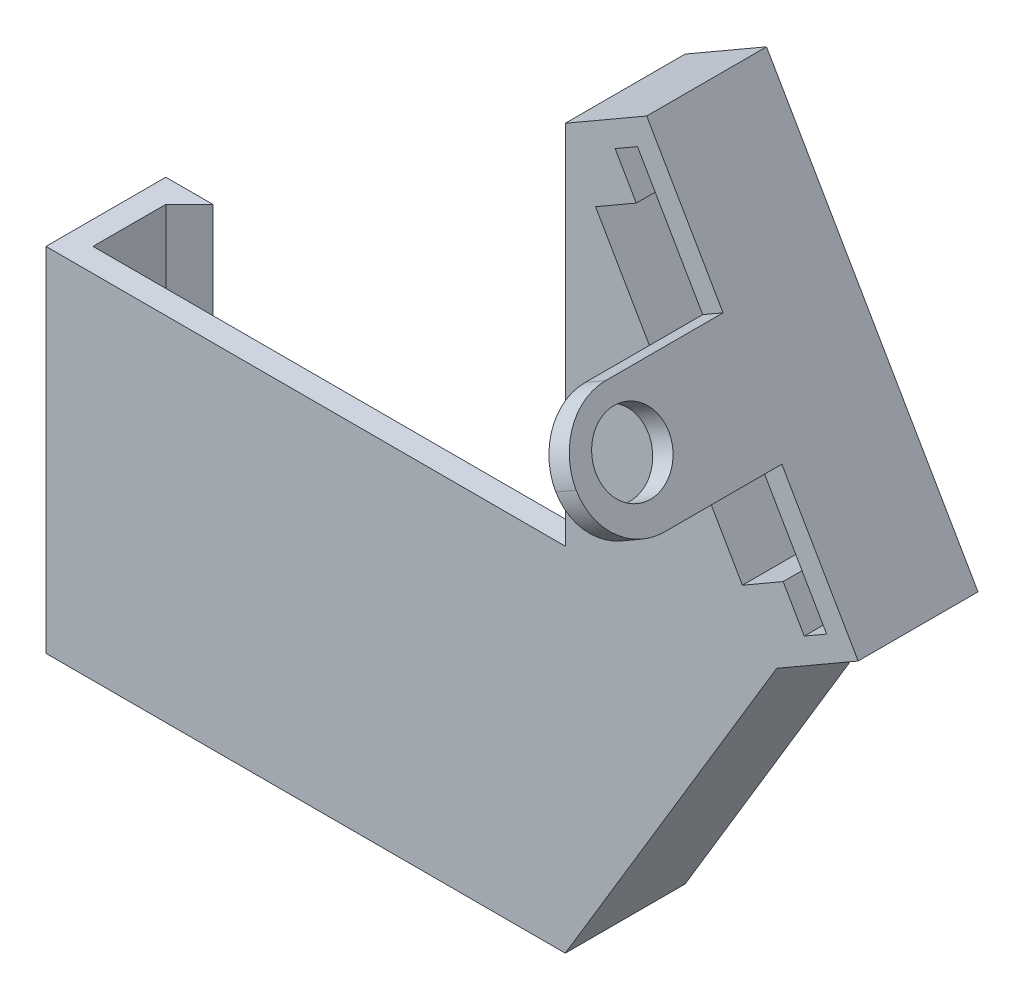
ISO-10303-21;
HEADER;
FILE_DESCRIPTION(('STEP AP214'),'2;1');
FILE_NAME('part.step','',(''),(''),'','','');
FILE_SCHEMA(('AUTOMOTIVE_DESIGN { 1 0 10303 214 1 1 1 1 }'));
ENDSEC;
DATA;
#1=APPLICATION_CONTEXT('core data for automotive mechanical design processes');
#2=APPLICATION_PROTOCOL_DEFINITION('international standard','automotive_design',2000,#1);
#3=PRODUCT_CONTEXT('',#1,'mechanical');
#4=PRODUCT('Part','Part','',(#3));
#5=PRODUCT_RELATED_PRODUCT_CATEGORY('part','',(#4));
#6=PRODUCT_DEFINITION_FORMATION('','',#4);
#7=PRODUCT_DEFINITION_CONTEXT('part definition',#1,'design');
#8=PRODUCT_DEFINITION('design','',#6,#7);
#9=PRODUCT_DEFINITION_SHAPE('','',#8);
#10=(LENGTH_UNIT() NAMED_UNIT(*) SI_UNIT(.MILLI.,.METRE.));
#11=(NAMED_UNIT(*) PLANE_ANGLE_UNIT() SI_UNIT($,.RADIAN.));
#12=(NAMED_UNIT(*) SI_UNIT($,.STERADIAN.) SOLID_ANGLE_UNIT());
#13=UNCERTAINTY_MEASURE_WITH_UNIT(LENGTH_MEASURE(1.E-05),#10,'distance_accuracy_value','');
#14=(GEOMETRIC_REPRESENTATION_CONTEXT(3) GLOBAL_UNCERTAINTY_ASSIGNED_CONTEXT((#13)) GLOBAL_UNIT_ASSIGNED_CONTEXT((#10,
#11,#12)) REPRESENTATION_CONTEXT('',''));
#15=CARTESIAN_POINT('',(0.,0.,0.));
#16=DIRECTION('',(0.,0.,1.));
#17=DIRECTION('',(1.,0.,0.));
#18=AXIS2_PLACEMENT_3D('',#15,#16,#17);
#19=CARTESIAN_POINT('',(-18.1,30.,-5.09999999999998));
#20=DIRECTION('',(-0.707106781186544,0.,-0.707106781186552));
#21=DIRECTION('',(-0.707106781186552,0.,0.707106781186544));
#22=AXIS2_PLACEMENT_3D('',#19,#20,#21);
#23=PLANE('',#22);
#24=DIRECTION('',(0.707106781186552,0.,-0.707106781186544));
#25=VECTOR('',#24,1.);
#26=CARTESIAN_POINT('',(-18.1,0.,-5.09999999999998));
#27=LINE('',#26,#25);
#28=CARTESIAN_POINT('',(-20.1,0.,-3.1));
#29=VERTEX_POINT('',#28);
#30=CARTESIAN_POINT('',(-18.1,0.,-5.09999999999998));
#31=VERTEX_POINT('',#30);
#32=EDGE_CURVE('E337',#29,#31,#27,.T.);
#33=ORIENTED_EDGE('',*,*,#32,.T.);
#34=DIRECTION('',(0.,-1.,0.));
#35=VECTOR('',#34,1.);
#36=CARTESIAN_POINT('',(-18.1,30.,-5.09999999999998));
#37=LINE('',#36,#35);
#38=CARTESIAN_POINT('',(-18.1,30.,-5.09999999999998));
#39=VERTEX_POINT('',#38);
#40=EDGE_CURVE('E411',#39,#31,#37,.T.);
#41=ORIENTED_EDGE('',*,*,#40,.F.);
#42=DIRECTION('',(0.707106781186552,0.,-0.707106781186544));
#43=VECTOR('',#42,1.);
#44=CARTESIAN_POINT('',(-18.1,30.,-5.09999999999998));
#45=LINE('',#44,#43);
#46=CARTESIAN_POINT('',(-20.1,30.,-3.1));
#47=VERTEX_POINT('',#46);
#48=EDGE_CURVE('E338',#47,#39,#45,.T.);
#49=ORIENTED_EDGE('',*,*,#48,.F.);
#50=DIRECTION('',(0.,-1.,0.));
#51=VECTOR('',#50,1.);
#52=CARTESIAN_POINT('',(-20.1,30.,-3.1));
#53=LINE('',#52,#51);
#54=EDGE_CURVE('E364',#47,#29,#53,.T.);
#55=ORIENTED_EDGE('',*,*,#54,.T.);
#56=EDGE_LOOP('',(#33,#41,#49,#55));
#57=FACE_BOUND('',#56,.T.);
#58=ADVANCED_FACE('F33',(#57),#23,.F.);
#59=CARTESIAN_POINT('',(-22.1,30.,-5.09999999999998));
#60=DIRECTION('',(0.,0.,1.));
#61=DIRECTION('',(1.,0.,0.));
#62=AXIS2_PLACEMENT_3D('',#59,#60,#61);
#63=PLANE('',#62);
#64=DIRECTION('',(-1.,0.,0.));
#65=VECTOR('',#64,1.);
#66=CARTESIAN_POINT('',(-22.1,0.,-5.09999999999998));
#67=LINE('',#66,#65);
#68=CARTESIAN_POINT('',(-22.1,0.,-5.09999999999998));
#69=VERTEX_POINT('',#68);
#70=EDGE_CURVE('E367',#31,#69,#67,.T.);
#71=ORIENTED_EDGE('',*,*,#70,.T.);
#72=DIRECTION('',(0.,-1.,0.));
#73=VECTOR('',#72,1.);
#74=CARTESIAN_POINT('',(-22.1,30.,-5.09999999999998));
#75=LINE('',#74,#73);
#76=CARTESIAN_POINT('',(-22.1,30.,-5.09999999999998));
#77=VERTEX_POINT('',#76);
#78=EDGE_CURVE('E408',#77,#69,#75,.T.);
#79=ORIENTED_EDGE('',*,*,#78,.F.);
#80=DIRECTION('',(-1.,0.,0.));
#81=VECTOR('',#80,1.);
#82=CARTESIAN_POINT('',(-22.1,30.,-5.09999999999998));
#83=LINE('',#82,#81);
#84=EDGE_CURVE('E341',#39,#77,#83,.T.);
#85=ORIENTED_EDGE('',*,*,#84,.F.);
#86=ORIENTED_EDGE('',*,*,#40,.T.);
#87=EDGE_LOOP('',(#71,#79,#85,#86));
#88=FACE_BOUND('',#87,.T.);
#89=ADVANCED_FACE('F462',(#88),#63,.F.);
#90=CARTESIAN_POINT('',(-22.1,30.,5.1));
#91=DIRECTION('',(1.,0.,0.));
#92=DIRECTION('',(0.,0.,-1.));
#93=AXIS2_PLACEMENT_3D('',#90,#91,#92);
#94=PLANE('',#93);
#95=DIRECTION('',(0.,0.,1.));
#96=VECTOR('',#95,1.);
#97=CARTESIAN_POINT('',(-22.1,0.,5.1));
#98=LINE('',#97,#96);
#99=CARTESIAN_POINT('',(-22.1,0.,5.1));
#100=VERTEX_POINT('',#99);
#101=EDGE_CURVE('E369',#69,#100,#98,.T.);
#102=ORIENTED_EDGE('',*,*,#101,.T.);
#103=DIRECTION('',(0.,-1.,0.));
#104=VECTOR('',#103,1.);
#105=CARTESIAN_POINT('',(-22.1,30.,5.1));
#106=LINE('',#105,#104);
#107=CARTESIAN_POINT('',(-22.1,30.,5.1));
#108=VERTEX_POINT('',#107);
#109=EDGE_CURVE('E405',#108,#100,#106,.T.);
#110=ORIENTED_EDGE('',*,*,#109,.F.);
#111=DIRECTION('',(0.,0.,1.));
#112=VECTOR('',#111,1.);
#113=CARTESIAN_POINT('',(-22.1,30.,5.1));
#114=LINE('',#113,#112);
#115=EDGE_CURVE('E344',#77,#108,#114,.T.);
#116=ORIENTED_EDGE('',*,*,#115,.F.);
#117=ORIENTED_EDGE('',*,*,#78,.T.);
#118=EDGE_LOOP('',(#102,#110,#116,#117));
#119=FACE_BOUND('',#118,.T.);
#120=ADVANCED_FACE('F468',(#119),#94,.F.);
#121=CARTESIAN_POINT('',(22.1,30.,5.1));
#122=DIRECTION('',(0.,0.,-1.));
#123=DIRECTION('',(-1.,0.,0.));
#124=AXIS2_PLACEMENT_3D('',#121,#122,#123);
#125=PLANE('',#124);
#126=DIRECTION('',(-0.499999999999994,0.866025403784442,0.));
#127=VECTOR('',#126,1.);
#128=CARTESIAN_POINT('',(44.3461524227063,34.6454482671902,5.1));
#129=LINE('',#128,#127);
#130=CARTESIAN_POINT('',(33.7961524227064,52.918584287042,5.1));
#131=VERTEX_POINT('',#130);
#132=CARTESIAN_POINT('',(28.2461524227065,62.5314662690493,5.1));
#133=VERTEX_POINT('',#132);
#134=EDGE_CURVE('E271',#131,#133,#129,.T.);
#135=ORIENTED_EDGE('',*,*,#134,.F.);
#136=DIRECTION('',(0.866025403784442,0.499999999999994,0.));
#137=VECTOR('',#136,1.);
#138=CARTESIAN_POINT('',(18.1836574267103,43.9047060983821,5.1));
#139=LINE('',#138,#137);
#140=CARTESIAN_POINT('',(35.5282032302755,53.9185842870421,5.1));
#141=VERTEX_POINT('',#140);
#142=EDGE_CURVE('E228',#131,#141,#139,.T.);
#143=ORIENTED_EDGE('',*,*,#142,.T.);
#144=DIRECTION('',(-0.499999999999994,0.866025403784442,0.));
#145=VECTOR('',#144,1.);
#146=CARTESIAN_POINT('',(47.0282032302753,34.,5.1));
#147=LINE('',#146,#145);
#148=CARTESIAN_POINT('',(29.0282032302756,65.1769145362399,5.1));
#149=VERTEX_POINT('',#148);
#150=EDGE_CURVE('E241',#141,#149,#147,.T.);
#151=ORIENTED_EDGE('',*,*,#150,.T.);
#152=DIRECTION('',(-0.866025403784441,-0.499999999999996,0.));
#153=VECTOR('',#152,1.);
#154=CARTESIAN_POINT('',(29.0282032302756,65.1769145362399,5.1));
#155=LINE('',#154,#153);
#156=CARTESIAN_POINT('',(22.1,61.1769145362399,5.1));
#157=VERTEX_POINT('',#156);
#158=EDGE_CURVE('E240',#149,#157,#155,.T.);
#159=ORIENTED_EDGE('',*,*,#158,.T.);
#160=DIRECTION('',(0.,-1.,0.));
#161=VECTOR('',#160,1.);
#162=CARTESIAN_POINT('',(22.1,0.,5.1));
#163=LINE('',#162,#161);
#164=CARTESIAN_POINT('',(22.1,30.,5.1));
#165=VERTEX_POINT('',#164);
#166=EDGE_CURVE('E323',#157,#165,#163,.T.);
#167=ORIENTED_EDGE('',*,*,#166,.T.);
#168=DIRECTION('',(1.,0.,0.));
#169=VECTOR('',#168,1.);
#170=CARTESIAN_POINT('',(22.1,30.,5.1));
#171=LINE('',#170,#169);
#172=EDGE_CURVE('E346',#108,#165,#171,.T.);
#173=ORIENTED_EDGE('',*,*,#172,.F.);
#174=ORIENTED_EDGE('',*,*,#109,.T.);
#175=DIRECTION('',(1.,0.,0.));
#176=VECTOR('',#175,1.);
#177=CARTESIAN_POINT('',(22.1,0.,5.1));
#178=LINE('',#177,#176);
#179=CARTESIAN_POINT('',(22.1,0.,5.1));
#180=VERTEX_POINT('',#179);
#181=EDGE_CURVE('E371',#100,#180,#178,.T.);
#182=ORIENTED_EDGE('',*,*,#181,.T.);
#183=DIRECTION('',(0.514495755427523,0.857492925712547,0.));
#184=VECTOR('',#183,1.);
#185=CARTESIAN_POINT('',(40.0999999999998,30.,5.1));
#186=LINE('',#185,#184);
#187=CARTESIAN_POINT('',(40.0999999999998,30.,5.1));
#188=VERTEX_POINT('',#187);
#189=EDGE_CURVE('E326',#180,#188,#186,.T.);
#190=ORIENTED_EDGE('',*,*,#189,.T.);
#191=DIRECTION('',(0.866025403784442,0.499999999999994,0.));
#192=VECTOR('',#191,1.);
#193=CARTESIAN_POINT('',(47.0282032302753,34.,5.1));
#194=LINE('',#193,#192);
#195=CARTESIAN_POINT('',(47.0282032302753,34.,5.1));
#196=VERTEX_POINT('',#195);
#197=EDGE_CURVE('E239',#188,#196,#194,.T.);
#198=ORIENTED_EDGE('',*,*,#197,.T.);
#199=CARTESIAN_POINT('',(40.5282032302754,45.2583302491977,5.1));
#200=VERTEX_POINT('',#199);
#201=EDGE_CURVE('E223',#196,#200,#147,.T.);
#202=ORIENTED_EDGE('',*,*,#201,.T.);
#203=DIRECTION('',(0.866025403784442,0.499999999999994,0.));
#204=VECTOR('',#203,1.);
#205=CARTESIAN_POINT('',(23.1836574267102,35.2444520605377,5.1));
#206=LINE('',#205,#204);
#207=CARTESIAN_POINT('',(38.7961524227063,44.2583302491976,5.1));
#208=VERTEX_POINT('',#207);
#209=EDGE_CURVE('E235',#208,#200,#206,.T.);
#210=ORIENTED_EDGE('',*,*,#209,.F.);
#211=CARTESIAN_POINT('',(44.3461524227063,34.6454482671902,5.1));
#212=VERTEX_POINT('',#211);
#213=EDGE_CURVE('E272',#212,#208,#129,.T.);
#214=ORIENTED_EDGE('',*,*,#213,.F.);
#215=DIRECTION('',(0.866025403784442,0.499999999999993,0.));
#216=VECTOR('',#215,1.);
#217=CARTESIAN_POINT('',(44.3461524227063,34.6454482671902,5.1));
#218=LINE('',#217,#216);
#219=CARTESIAN_POINT('',(42.4408965343803,33.5454482671902,5.1));
#220=VERTEX_POINT('',#219);
#221=EDGE_CURVE('E252',#220,#212,#218,.T.);
#222=ORIENTED_EDGE('',*,*,#221,.F.);
#223=DIRECTION('',(0.499999999999947,-0.866025403784469,0.));
#224=VECTOR('',#223,1.);
#225=CARTESIAN_POINT('',(42.4408965343803,33.5454482671902,5.1));
#226=LINE('',#225,#224);
#227=CARTESIAN_POINT('',(40.6408965343805,36.6631397208143,5.1));
#228=VERTEX_POINT('',#227);
#229=EDGE_CURVE('E289',#228,#220,#226,.T.);
#230=ORIENTED_EDGE('',*,*,#229,.F.);
#231=DIRECTION('',(0.866025403784444,0.49999999999999,0.));
#232=VECTOR('',#231,1.);
#233=CARTESIAN_POINT('',(40.6408965343805,36.6631397208143,5.1));
#234=LINE('',#233,#232);
#235=CARTESIAN_POINT('',(37.1767949192425,34.6631397208142,5.1));
#236=VERTEX_POINT('',#235);
#237=EDGE_CURVE('E286',#236,#228,#234,.T.);
#238=ORIENTED_EDGE('',*,*,#237,.F.);
#239=DIRECTION('',(0.499999999999994,-0.866025403784442,0.));
#240=VECTOR('',#239,1.);
#241=CARTESIAN_POINT('',(24.6767949192427,56.3137748154253,5.1));
#242=LINE('',#241,#240);
#243=CARTESIAN_POINT('',(24.6767949192427,56.3137748154253,5.1));
#244=VERTEX_POINT('',#243);
#245=EDGE_CURVE('E283',#244,#236,#242,.T.);
#246=ORIENTED_EDGE('',*,*,#245,.F.);
#247=DIRECTION('',(-0.866025403784441,-0.499999999999996,0.));
#248=VECTOR('',#247,1.);
#249=CARTESIAN_POINT('',(28.1408965343804,58.3137748154252,5.1));
#250=LINE('',#249,#248);
#251=CARTESIAN_POINT('',(28.1408965343804,58.3137748154252,5.1));
#252=VERTEX_POINT('',#251);
#253=EDGE_CURVE('E280',#252,#244,#250,.T.);
#254=ORIENTED_EDGE('',*,*,#253,.F.);
#255=DIRECTION('',(0.499999999999944,-0.866025403784471,0.));
#256=VECTOR('',#255,1.);
#257=CARTESIAN_POINT('',(28.1408965343804,58.3137748154252,5.1));
#258=LINE('',#257,#256);
#259=CARTESIAN_POINT('',(26.3408965343807,61.4314662690493,5.1));
#260=VERTEX_POINT('',#259);
#261=EDGE_CURVE('E277',#260,#252,#258,.T.);
#262=ORIENTED_EDGE('',*,*,#261,.F.);
#263=DIRECTION('',(-0.866025403784441,-0.499999999999995,0.));
#264=VECTOR('',#263,1.);
#265=CARTESIAN_POINT('',(28.2461524227065,62.5314662690493,5.1));
#266=LINE('',#265,#264);
#267=EDGE_CURVE('E274',#133,#260,#266,.T.);
#268=ORIENTED_EDGE('',*,*,#267,.F.);
#269=EDGE_LOOP('',(#135,#143,#151,#159,#167,#173,#174,#182,#190,#198,#202,#210,#214,#222,#230,
#238,#246,#254,#262,#268));
#270=FACE_BOUND('',#269,.T.);
#271=ADVANCED_FACE('F233',(#270),#125,.F.);
#272=CARTESIAN_POINT('',(18.1,30.,-5.09999999999998));
#273=DIRECTION('',(0.,0.,1.));
#274=DIRECTION('',(1.,0.,0.));
#275=AXIS2_PLACEMENT_3D('',#272,#273,#274);
#276=PLANE('',#275);
#277=DIRECTION('',(-0.499999999999947,0.866025403784469,0.));
#278=VECTOR('',#277,1.);
#279=CARTESIAN_POINT('',(42.4408965343803,33.5454482671902,-5.09999999999999));
#280=LINE('',#279,#278);
#281=CARTESIAN_POINT('',(42.4408965343803,33.5454482671902,-5.09999999999999));
#282=VERTEX_POINT('',#281);
#283=CARTESIAN_POINT('',(40.6408965343805,36.6631397208143,-5.09999999999999));
#284=VERTEX_POINT('',#283);
#285=EDGE_CURVE('E265',#282,#284,#280,.T.);
#286=ORIENTED_EDGE('',*,*,#285,.F.);
#287=DIRECTION('',(-0.866025403784442,-0.499999999999994,0.));
#288=VECTOR('',#287,1.);
#289=CARTESIAN_POINT('',(44.3461524227063,34.6454482671902,-5.09999999999999));
#290=LINE('',#289,#288);
#291=CARTESIAN_POINT('',(44.3461524227063,34.6454482671902,-5.09999999999999));
#292=VERTEX_POINT('',#291);
#293=EDGE_CURVE('E267',#292,#282,#290,.T.);
#294=ORIENTED_EDGE('',*,*,#293,.F.);
#295=DIRECTION('',(0.499999999999994,-0.866025403784442,0.));
#296=VECTOR('',#295,1.);
#297=CARTESIAN_POINT('',(44.3461524227063,34.6454482671902,-5.09999999999999));
#298=LINE('',#297,#296);
#299=CARTESIAN_POINT('',(28.2461524227065,62.5314662690493,-5.09999999999998));
#300=VERTEX_POINT('',#299);
#301=EDGE_CURVE('E269',#300,#292,#298,.T.);
#302=ORIENTED_EDGE('',*,*,#301,.F.);
#303=DIRECTION('',(0.866025403784441,0.499999999999995,0.));
#304=VECTOR('',#303,1.);
#305=CARTESIAN_POINT('',(28.2461524227065,62.5314662690493,-5.09999999999998));
#306=LINE('',#305,#304);
#307=CARTESIAN_POINT('',(26.3408965343807,61.4314662690493,-5.09999999999998));
#308=VERTEX_POINT('',#307);
#309=EDGE_CURVE('E253',#308,#300,#306,.T.);
#310=ORIENTED_EDGE('',*,*,#309,.F.);
#311=DIRECTION('',(-0.499999999999944,0.866025403784471,0.));
#312=VECTOR('',#311,1.);
#313=CARTESIAN_POINT('',(28.1408965343805,58.3137748154252,-5.09999999999998));
#314=LINE('',#313,#312);
#315=CARTESIAN_POINT('',(28.1408965343805,58.3137748154252,-5.09999999999998));
#316=VERTEX_POINT('',#315);
#317=EDGE_CURVE('E256',#316,#308,#314,.T.);
#318=ORIENTED_EDGE('',*,*,#317,.F.);
#319=DIRECTION('',(0.866025403784441,0.499999999999996,0.));
#320=VECTOR('',#319,1.);
#321=CARTESIAN_POINT('',(28.1408965343805,58.3137748154252,-5.09999999999998));
#322=LINE('',#321,#320);
#323=CARTESIAN_POINT('',(24.6767949192427,56.3137748154253,-5.09999999999998));
#324=VERTEX_POINT('',#323);
#325=EDGE_CURVE('E259',#324,#316,#322,.T.);
#326=ORIENTED_EDGE('',*,*,#325,.F.);
#327=DIRECTION('',(-0.499999999999994,0.866025403784442,0.));
#328=VECTOR('',#327,1.);
#329=CARTESIAN_POINT('',(24.6767949192427,56.3137748154253,-5.09999999999998));
#330=LINE('',#329,#328);
#331=CARTESIAN_POINT('',(37.1767949192425,34.6631397208142,-5.09999999999998));
#332=VERTEX_POINT('',#331);
#333=EDGE_CURVE('E261',#332,#324,#330,.T.);
#334=ORIENTED_EDGE('',*,*,#333,.F.);
#335=DIRECTION('',(-0.866025403784445,-0.49999999999999,0.));
#336=VECTOR('',#335,1.);
#337=CARTESIAN_POINT('',(40.6408965343805,36.6631397208143,-5.09999999999999));
#338=LINE('',#337,#336);
#339=EDGE_CURVE('E263',#284,#332,#338,.T.);
#340=ORIENTED_EDGE('',*,*,#339,.F.);
#341=EDGE_LOOP('',(#286,#294,#302,#310,#318,#326,#334,#340));
#342=FACE_BOUND('',#341,.T.);
#343=DIRECTION('',(-1.,0.,0.));
#344=VECTOR('',#343,1.);
#345=CARTESIAN_POINT('',(18.1,0.,-5.09999999999998));
#346=LINE('',#345,#344);
#347=CARTESIAN_POINT('',(22.1,0.,-5.09999999999998));
#348=VERTEX_POINT('',#347);
#349=CARTESIAN_POINT('',(18.1,0.,-5.09999999999998));
#350=VERTEX_POINT('',#349);
#351=EDGE_CURVE('E377',#348,#350,#346,.T.);
#352=ORIENTED_EDGE('',*,*,#351,.T.);
#353=DIRECTION('',(0.,-1.,0.));
#354=VECTOR('',#353,1.);
#355=CARTESIAN_POINT('',(18.1,30.,-5.09999999999998));
#356=LINE('',#355,#354);
#357=CARTESIAN_POINT('',(18.1,30.,-5.09999999999998));
#358=VERTEX_POINT('',#357);
#359=EDGE_CURVE('E402',#358,#350,#356,.T.);
#360=ORIENTED_EDGE('',*,*,#359,.F.);
#361=DIRECTION('',(-1.,0.,0.));
#362=VECTOR('',#361,1.);
#363=CARTESIAN_POINT('',(18.1,30.,-5.09999999999998));
#364=LINE('',#363,#362);
#365=CARTESIAN_POINT('',(22.1,30.,-5.09999999999998));
#366=VERTEX_POINT('',#365);
#367=EDGE_CURVE('E352',#366,#358,#364,.T.);
#368=ORIENTED_EDGE('',*,*,#367,.F.);
#369=DIRECTION('',(0.,1.,0.));
#370=VECTOR('',#369,1.);
#371=CARTESIAN_POINT('',(22.1,0.,-5.09999999999998));
#372=LINE('',#371,#370);
#373=CARTESIAN_POINT('',(22.1,61.1769145362399,-5.09999999999998));
#374=VERTEX_POINT('',#373);
#375=EDGE_CURVE('E312',#366,#374,#372,.T.);
#376=ORIENTED_EDGE('',*,*,#375,.T.);
#377=DIRECTION('',(0.866025403784441,0.499999999999996,0.));
#378=VECTOR('',#377,1.);
#379=CARTESIAN_POINT('',(29.0282032302756,65.1769145362399,-5.09999999999998));
#380=LINE('',#379,#378);
#381=CARTESIAN_POINT('',(29.0282032302756,65.1769145362399,-5.09999999999998));
#382=VERTEX_POINT('',#381);
#383=EDGE_CURVE('E310',#374,#382,#380,.T.);
#384=ORIENTED_EDGE('',*,*,#383,.T.);
#385=DIRECTION('',(0.499999999999994,-0.866025403784442,0.));
#386=VECTOR('',#385,1.);
#387=CARTESIAN_POINT('',(47.0282032302753,34.,-5.09999999999998));
#388=LINE('',#387,#386);
#389=CARTESIAN_POINT('',(47.0282032302753,34.,-5.09999999999998));
#390=VERTEX_POINT('',#389);
#391=EDGE_CURVE('E319',#382,#390,#388,.T.);
#392=ORIENTED_EDGE('',*,*,#391,.T.);
#393=DIRECTION('',(-0.866025403784442,-0.499999999999994,0.));
#394=VECTOR('',#393,1.);
#395=CARTESIAN_POINT('',(47.0282032302754,34.,-5.09999999999998));
#396=LINE('',#395,#394);
#397=CARTESIAN_POINT('',(40.0999999999998,30.,-5.09999999999998));
#398=VERTEX_POINT('',#397);
#399=EDGE_CURVE('E317',#390,#398,#396,.T.);
#400=ORIENTED_EDGE('',*,*,#399,.T.);
#401=DIRECTION('',(-0.514495755427523,-0.857492925712547,0.));
#402=VECTOR('',#401,1.);
#403=CARTESIAN_POINT('',(40.0999999999998,30.,-5.09999999999998));
#404=LINE('',#403,#402);
#405=EDGE_CURVE('E315',#398,#348,#404,.T.);
#406=ORIENTED_EDGE('',*,*,#405,.T.);
#407=EDGE_LOOP('',(#352,#360,#368,#376,#384,#392,#400,#406));
#408=FACE_BOUND('',#407,.T.);
#409=ADVANCED_FACE('F551',(#342,#408),#276,.F.);
#410=CARTESIAN_POINT('',(18.1,30.,-3.09999999999998));
#411=DIRECTION('',(1.,0.,0.));
#412=DIRECTION('',(0.,0.,-1.));
#413=AXIS2_PLACEMENT_3D('',#410,#411,#412);
#414=PLANE('',#413);
#415=DIRECTION('',(0.,0.,1.));
#416=VECTOR('',#415,1.);
#417=CARTESIAN_POINT('',(18.1,0.,-3.09999999999998));
#418=LINE('',#417,#416);
#419=CARTESIAN_POINT('',(18.1,0.,-3.09999999999998));
#420=VERTEX_POINT('',#419);
#421=EDGE_CURVE('E379',#350,#420,#418,.T.);
#422=ORIENTED_EDGE('',*,*,#421,.T.);
#423=DIRECTION('',(0.,-1.,0.));
#424=VECTOR('',#423,1.);
#425=CARTESIAN_POINT('',(18.1,30.,-3.09999999999998));
#426=LINE('',#425,#424);
#427=CARTESIAN_POINT('',(18.1,30.,-3.09999999999998));
#428=VERTEX_POINT('',#427);
#429=EDGE_CURVE('E399',#428,#420,#426,.T.);
#430=ORIENTED_EDGE('',*,*,#429,.F.);
#431=DIRECTION('',(0.,0.,1.));
#432=VECTOR('',#431,1.);
#433=CARTESIAN_POINT('',(18.1,30.,-3.09999999999998));
#434=LINE('',#433,#432);
#435=EDGE_CURVE('E354',#358,#428,#434,.T.);
#436=ORIENTED_EDGE('',*,*,#435,.F.);
#437=ORIENTED_EDGE('',*,*,#359,.T.);
#438=EDGE_LOOP('',(#422,#430,#436,#437));
#439=FACE_BOUND('',#438,.T.);
#440=ADVANCED_FACE('F559',(#439),#414,.F.);
#441=CARTESIAN_POINT('',(20.1,30.,-3.1));
#442=DIRECTION('',(0.,0.,-1.));
#443=DIRECTION('',(-1.,0.,0.));
#444=AXIS2_PLACEMENT_3D('',#441,#442,#443);
#445=PLANE('',#444);
#446=DIRECTION('',(1.,0.,0.));
#447=VECTOR('',#446,1.);
#448=CARTESIAN_POINT('',(20.1,0.,-3.1));
#449=LINE('',#448,#447);
#450=CARTESIAN_POINT('',(20.1,0.,-3.1));
#451=VERTEX_POINT('',#450);
#452=EDGE_CURVE('E381',#420,#451,#449,.T.);
#453=ORIENTED_EDGE('',*,*,#452,.T.);
#454=DIRECTION('',(0.,-1.,0.));
#455=VECTOR('',#454,1.);
#456=CARTESIAN_POINT('',(20.1,30.,-3.1));
#457=LINE('',#456,#455);
#458=CARTESIAN_POINT('',(20.1,30.,-3.1));
#459=VERTEX_POINT('',#458);
#460=EDGE_CURVE('E396',#459,#451,#457,.T.);
#461=ORIENTED_EDGE('',*,*,#460,.F.);
#462=DIRECTION('',(1.,0.,0.));
#463=VECTOR('',#462,1.);
#464=CARTESIAN_POINT('',(20.1,30.,-3.1));
#465=LINE('',#464,#463);
#466=EDGE_CURVE('E356',#428,#459,#465,.T.);
#467=ORIENTED_EDGE('',*,*,#466,.F.);
#468=ORIENTED_EDGE('',*,*,#429,.T.);
#469=EDGE_LOOP('',(#453,#461,#467,#468));
#470=FACE_BOUND('',#469,.T.);
#471=ADVANCED_FACE('F562',(#470),#445,.F.);
#472=CARTESIAN_POINT('',(20.1,30.,3.1));
#473=DIRECTION('',(1.,0.,0.));
#474=DIRECTION('',(0.,0.,-1.));
#475=AXIS2_PLACEMENT_3D('',#472,#473,#474);
#476=PLANE('',#475);
#477=DIRECTION('',(0.,0.,1.));
#478=VECTOR('',#477,1.);
#479=CARTESIAN_POINT('',(20.1,0.,3.1));
#480=LINE('',#479,#478);
#481=CARTESIAN_POINT('',(20.1,0.,3.1));
#482=VERTEX_POINT('',#481);
#483=EDGE_CURVE('E383',#451,#482,#480,.T.);
#484=ORIENTED_EDGE('',*,*,#483,.T.);
#485=DIRECTION('',(0.,-1.,0.));
#486=VECTOR('',#485,1.);
#487=CARTESIAN_POINT('',(20.1,30.,3.1));
#488=LINE('',#487,#486);
#489=CARTESIAN_POINT('',(20.1,30.,3.1));
#490=VERTEX_POINT('',#489);
#491=EDGE_CURVE('E393',#490,#482,#488,.T.);
#492=ORIENTED_EDGE('',*,*,#491,.F.);
#493=DIRECTION('',(0.,0.,1.));
#494=VECTOR('',#493,1.);
#495=CARTESIAN_POINT('',(20.1,30.,3.1));
#496=LINE('',#495,#494);
#497=EDGE_CURVE('E358',#459,#490,#496,.T.);
#498=ORIENTED_EDGE('',*,*,#497,.F.);
#499=ORIENTED_EDGE('',*,*,#460,.T.);
#500=EDGE_LOOP('',(#484,#492,#498,#499));
#501=FACE_BOUND('',#500,.T.);
#502=ADVANCED_FACE('F567',(#501),#476,.F.);
#503=CARTESIAN_POINT('',(20.1,30.,3.1));
#504=DIRECTION('',(0.,0.,1.));
#505=DIRECTION('',(1.,0.,0.));
#506=AXIS2_PLACEMENT_3D('',#503,#504,#505);
#507=PLANE('',#506);
#508=DIRECTION('',(-1.,0.,0.));
#509=VECTOR('',#508,1.);
#510=CARTESIAN_POINT('',(20.1,0.,3.1));
#511=LINE('',#510,#509);
#512=CARTESIAN_POINT('',(-20.1,0.,3.1));
#513=VERTEX_POINT('',#512);
#514=EDGE_CURVE('E385',#482,#513,#511,.T.);
#515=ORIENTED_EDGE('',*,*,#514,.T.);
#516=DIRECTION('',(0.,-1.,0.));
#517=VECTOR('',#516,1.);
#518=CARTESIAN_POINT('',(-20.1,30.,3.1));
#519=LINE('',#518,#517);
#520=CARTESIAN_POINT('',(-20.1,30.,3.1));
#521=VERTEX_POINT('',#520);
#522=EDGE_CURVE('E390',#521,#513,#519,.T.);
#523=ORIENTED_EDGE('',*,*,#522,.F.);
#524=DIRECTION('',(-1.,0.,0.));
#525=VECTOR('',#524,1.);
#526=CARTESIAN_POINT('',(20.1,30.,3.1));
#527=LINE('',#526,#525);
#528=EDGE_CURVE('E360',#490,#521,#527,.T.);
#529=ORIENTED_EDGE('',*,*,#528,.F.);
#530=ORIENTED_EDGE('',*,*,#491,.T.);
#531=EDGE_LOOP('',(#515,#523,#529,#530));
#532=FACE_BOUND('',#531,.T.);
#533=ADVANCED_FACE('F573',(#532),#507,.F.);
#534=CARTESIAN_POINT('',(-20.1,30.,3.1));
#535=DIRECTION('',(-1.,0.,0.));
#536=DIRECTION('',(0.,0.,1.));
#537=AXIS2_PLACEMENT_3D('',#534,#535,#536);
#538=PLANE('',#537);
#539=DIRECTION('',(0.,0.,-1.));
#540=VECTOR('',#539,1.);
#541=CARTESIAN_POINT('',(-20.1,0.,3.1));
#542=LINE('',#541,#540);
#543=EDGE_CURVE('E342',#513,#29,#542,.T.);
#544=ORIENTED_EDGE('',*,*,#543,.T.);
#545=ORIENTED_EDGE('',*,*,#54,.F.);
#546=DIRECTION('',(0.,0.,-1.));
#547=VECTOR('',#546,1.);
#548=CARTESIAN_POINT('',(-20.1,30.,3.1));
#549=LINE('',#548,#547);
#550=EDGE_CURVE('E362',#521,#47,#549,.T.);
#551=ORIENTED_EDGE('',*,*,#550,.F.);
#552=ORIENTED_EDGE('',*,*,#522,.T.);
#553=EDGE_LOOP('',(#544,#545,#551,#552));
#554=FACE_BOUND('',#553,.T.);
#555=ADVANCED_FACE('F577',(#554),#538,.F.);
#556=CARTESIAN_POINT('',(0.,30.,0.));
#557=DIRECTION('',(0.,-1.,0.));
#558=DIRECTION('',(0.,0.,-1.));
#559=AXIS2_PLACEMENT_3D('',#556,#557,#558);
#560=PLANE('',#559);
#561=ORIENTED_EDGE('',*,*,#48,.T.);
#562=ORIENTED_EDGE('',*,*,#84,.T.);
#563=ORIENTED_EDGE('',*,*,#115,.T.);
#564=ORIENTED_EDGE('',*,*,#172,.T.);
#565=DIRECTION('',(0.,0.,-1.));
#566=VECTOR('',#565,1.);
#567=CARTESIAN_POINT('',(22.1,30.,-5.09999999999998));
#568=LINE('',#567,#566);
#569=EDGE_CURVE('E349',#165,#366,#568,.T.);
#570=ORIENTED_EDGE('',*,*,#569,.T.);
#571=ORIENTED_EDGE('',*,*,#367,.T.);
#572=ORIENTED_EDGE('',*,*,#435,.T.);
#573=ORIENTED_EDGE('',*,*,#466,.T.);
#574=ORIENTED_EDGE('',*,*,#497,.T.);
#575=ORIENTED_EDGE('',*,*,#528,.T.);
#576=ORIENTED_EDGE('',*,*,#550,.T.);
#577=EDGE_LOOP('',(#561,#562,#563,#564,#570,#571,#572,#573,#574,#575,#576));
#578=FACE_BOUND('',#577,.T.);
#579=ADVANCED_FACE('F526',(#578),#560,.F.);
#580=CARTESIAN_POINT('',(0.,0.,0.));
#581=DIRECTION('',(0.,-1.,0.));
#582=DIRECTION('',(0.,0.,-1.));
#583=AXIS2_PLACEMENT_3D('',#580,#581,#582);
#584=PLANE('',#583);
#585=ORIENTED_EDGE('',*,*,#32,.F.);
#586=ORIENTED_EDGE('',*,*,#543,.F.);
#587=ORIENTED_EDGE('',*,*,#514,.F.);
#588=ORIENTED_EDGE('',*,*,#483,.F.);
#589=ORIENTED_EDGE('',*,*,#452,.F.);
#590=ORIENTED_EDGE('',*,*,#421,.F.);
#591=ORIENTED_EDGE('',*,*,#351,.F.);
#592=DIRECTION('',(0.,0.,-1.));
#593=VECTOR('',#592,1.);
#594=CARTESIAN_POINT('',(22.1,0.,-5.09999999999998));
#595=LINE('',#594,#593);
#596=EDGE_CURVE('E374',#180,#348,#595,.T.);
#597=ORIENTED_EDGE('',*,*,#596,.F.);
#598=ORIENTED_EDGE('',*,*,#181,.F.);
#599=ORIENTED_EDGE('',*,*,#101,.F.);
#600=ORIENTED_EDGE('',*,*,#70,.F.);
#601=EDGE_LOOP('',(#585,#586,#587,#588,#589,#590,#591,#597,#598,#599,#600));
#602=FACE_BOUND('',#601,.T.);
#603=ADVANCED_FACE('F519',(#602),#584,.T.);
#604=CARTESIAN_POINT('',(22.1,0.,-74.8814123155603));
#605=DIRECTION('',(-1.,0.,0.));
#606=DIRECTION('',(0.,0.,1.));
#607=AXIS2_PLACEMENT_3D('',#604,#605,#606);
#608=PLANE('',#607);
#609=ORIENTED_EDGE('',*,*,#569,.F.);
#610=ORIENTED_EDGE('',*,*,#166,.F.);
#611=DIRECTION('',(0.,0.,1.));
#612=VECTOR('',#611,1.);
#613=CARTESIAN_POINT('',(22.1,61.1769145362399,-74.8814123155603));
#614=LINE('',#613,#612);
#615=EDGE_CURVE('E330',#374,#157,#614,.T.);
#616=ORIENTED_EDGE('',*,*,#615,.F.);
#617=ORIENTED_EDGE('',*,*,#375,.F.);
#618=EDGE_LOOP('',(#609,#610,#616,#617));
#619=FACE_BOUND('',#618,.T.);
#620=ADVANCED_FACE('F517',(#619),#608,.T.);
#621=CARTESIAN_POINT('',(47.0282032302753,34.,-74.8814123155603));
#622=DIRECTION('',(0.499999999999994,-0.866025403784442,0.));
#623=DIRECTION('',(0.866025403784442,0.499999999999994,0.));
#624=AXIS2_PLACEMENT_3D('',#621,#622,#623);
#625=PLANE('',#624);
#626=ORIENTED_EDGE('',*,*,#399,.F.);
#627=DIRECTION('',(0.,0.,1.));
#628=VECTOR('',#627,1.);
#629=CARTESIAN_POINT('',(47.0282032302753,34.,-74.8814123155603));
#630=LINE('',#629,#628);
#631=EDGE_CURVE('E328',#390,#196,#630,.T.);
#632=ORIENTED_EDGE('',*,*,#631,.T.);
#633=ORIENTED_EDGE('',*,*,#197,.F.);
#634=DIRECTION('',(0.,0.,1.));
#635=VECTOR('',#634,1.);
#636=CARTESIAN_POINT('',(40.0999999999998,30.,-74.8814123155603));
#637=LINE('',#636,#635);
#638=EDGE_CURVE('E313',#398,#188,#637,.T.);
#639=ORIENTED_EDGE('',*,*,#638,.F.);
#640=EDGE_LOOP('',(#626,#632,#633,#639));
#641=FACE_BOUND('',#640,.T.);
#642=ADVANCED_FACE('F515',(#641),#625,.T.);
#643=CARTESIAN_POINT('',(40.0999999999998,30.,-74.8814123155603));
#644=DIRECTION('',(0.857492925712547,-0.514495755427523,0.));
#645=DIRECTION('',(0.514495755427523,0.857492925712547,0.));
#646=AXIS2_PLACEMENT_3D('',#643,#644,#645);
#647=PLANE('',#646);
#648=ORIENTED_EDGE('',*,*,#405,.F.);
#649=ORIENTED_EDGE('',*,*,#638,.T.);
#650=ORIENTED_EDGE('',*,*,#189,.F.);
#651=ORIENTED_EDGE('',*,*,#596,.T.);
#652=EDGE_LOOP('',(#648,#649,#650,#651));
#653=FACE_BOUND('',#652,.T.);
#654=ADVANCED_FACE('F457',(#653),#647,.T.);
#655=CARTESIAN_POINT('',(29.0282032302756,65.1769145362399,-74.8814123155603));
#656=DIRECTION('',(-0.499999999999996,0.866025403784441,0.));
#657=DIRECTION('',(-0.866025403784441,-0.499999999999996,0.));
#658=AXIS2_PLACEMENT_3D('',#655,#656,#657);
#659=PLANE('',#658);
#660=ORIENTED_EDGE('',*,*,#383,.F.);
#661=ORIENTED_EDGE('',*,*,#615,.T.);
#662=ORIENTED_EDGE('',*,*,#158,.F.);
#663=DIRECTION('',(0.,0.,1.));
#664=VECTOR('',#663,1.);
#665=CARTESIAN_POINT('',(29.0282032302756,65.1769145362399,-74.8814123155603));
#666=LINE('',#665,#664);
#667=EDGE_CURVE('E332',#382,#149,#666,.T.);
#668=ORIENTED_EDGE('',*,*,#667,.F.);
#669=EDGE_LOOP('',(#660,#661,#662,#668));
#670=FACE_BOUND('',#669,.T.);
#671=ADVANCED_FACE('F448',(#670),#659,.T.);
#672=CARTESIAN_POINT('',(47.0282032302753,34.,-74.8814123155603));
#673=DIRECTION('',(0.866025403784442,0.499999999999994,0.));
#674=DIRECTION('',(-0.499999999999994,0.866025403784442,0.));
#675=AXIS2_PLACEMENT_3D('',#672,#673,#674);
#676=PLANE('',#675);
#677=CARTESIAN_POINT('',(37.8807666940213,49.8438248398041,15.1753041542548));
#678=DIRECTION('',(0.866025403784442,0.499999999999994,0.));
#679=DIRECTION('',(-0.499999999999994,0.866025403784442,0.));
#680=AXIS2_PLACEMENT_3D('',#677,#678,#679);
#681=CIRCLE('',#680,3.1);
#682=CARTESIAN_POINT('',(36.3307666940213,52.5285035915359,15.1753041542548));
#683=VERTEX_POINT('',#682);
#684=EDGE_CURVE('E436',#683,#683,#681,.T.);
#685=ORIENTED_EDGE('',*,*,#684,.F.);
#686=EDGE_LOOP('',(#685));
#687=FACE_BOUND('',#686,.T.);
#688=DIRECTION('',(0.,0.,1.));
#689=VECTOR('',#688,1.);
#690=CARTESIAN_POINT('',(35.5282032302755,53.9185842870421,5.1));
#691=LINE('',#690,#689);
#692=CARTESIAN_POINT('',(35.5282032302755,53.9185842870421,15.1));
#693=VERTEX_POINT('',#692);
#694=EDGE_CURVE('E229',#141,#693,#691,.T.);
#695=ORIENTED_EDGE('',*,*,#694,.T.);
#696=CARTESIAN_POINT('',(38.0282032302755,49.5884572681199,15.1));
#697=DIRECTION('',(0.866025403784442,0.499999999999994,0.));
#698=DIRECTION('',(-0.499999999999994,0.866025403784442,0.));
#699=AXIS2_PLACEMENT_3D('',#696,#697,#698);
#700=CIRCLE('',#699,5.);
#701=CARTESIAN_POINT('',(38.0282032302754,49.5884572681199,20.1));
#702=VERTEX_POINT('',#701);
#703=EDGE_CURVE('E418',#693,#702,#700,.T.);
#704=ORIENTED_EDGE('',*,*,#703,.T.);
#705=CARTESIAN_POINT('',(38.0282032302755,49.5884572681199,15.1));
#706=DIRECTION('',(0.866025403784442,0.499999999999994,0.));
#707=DIRECTION('',(-0.499999999999994,0.866025403784442,0.));
#708=AXIS2_PLACEMENT_3D('',#705,#706,#707);
#709=CIRCLE('',#708,5.);
#710=CARTESIAN_POINT('',(40.5282032302754,45.2583302491977,15.1));
#711=VERTEX_POINT('',#710);
#712=EDGE_CURVE('E226',#702,#711,#709,.T.);
#713=ORIENTED_EDGE('',*,*,#712,.T.);
#714=DIRECTION('',(0.,0.,-1.));
#715=VECTOR('',#714,1.);
#716=CARTESIAN_POINT('',(40.5282032302754,45.2583302491977,5.1));
#717=LINE('',#716,#715);
#718=EDGE_CURVE('E218',#711,#200,#717,.T.);
#719=ORIENTED_EDGE('',*,*,#718,.T.);
#720=ORIENTED_EDGE('',*,*,#201,.F.);
#721=ORIENTED_EDGE('',*,*,#631,.F.);
#722=ORIENTED_EDGE('',*,*,#391,.F.);
#723=ORIENTED_EDGE('',*,*,#667,.T.);
#724=ORIENTED_EDGE('',*,*,#150,.F.);
#725=EDGE_LOOP('',(#695,#704,#713,#719,#720,#721,#722,#723,#724));
#726=FACE_BOUND('',#725,.T.);
#727=ADVANCED_FACE('F221',(#687,#726),#676,.T.);
#728=CARTESIAN_POINT('',(44.3461524227063,34.6454482671902,-40.1295998293323));
#729=DIRECTION('',(0.499999999999994,-0.866025403784442,0.));
#730=DIRECTION('',(0.866025403784442,0.499999999999994,0.));
#731=AXIS2_PLACEMENT_3D('',#728,#729,#730);
#732=PLANE('',#731);
#733=ORIENTED_EDGE('',*,*,#293,.T.);
#734=DIRECTION('',(0.,0.,1.));
#735=VECTOR('',#734,1.);
#736=CARTESIAN_POINT('',(42.4408965343803,33.5454482671902,-40.1295998293323));
#737=LINE('',#736,#735);
#738=EDGE_CURVE('E257',#282,#220,#737,.T.);
#739=ORIENTED_EDGE('',*,*,#738,.T.);
#740=ORIENTED_EDGE('',*,*,#221,.T.);
#741=DIRECTION('',(0.,0.,1.));
#742=VECTOR('',#741,1.);
#743=CARTESIAN_POINT('',(44.3461524227063,34.6454482671902,-40.1295998293323));
#744=LINE('',#743,#742);
#745=EDGE_CURVE('E292',#292,#212,#744,.T.);
#746=ORIENTED_EDGE('',*,*,#745,.F.);
#747=EDGE_LOOP('',(#733,#739,#740,#746));
#748=FACE_BOUND('',#747,.T.);
#749=ADVANCED_FACE('F447',(#748),#732,.F.);
#750=CARTESIAN_POINT('',(42.4408965343803,33.5454482671902,-40.1295998293323));
#751=DIRECTION('',(-0.866025403784469,-0.499999999999947,0.));
#752=DIRECTION('',(0.499999999999947,-0.866025403784469,0.));
#753=AXIS2_PLACEMENT_3D('',#750,#751,#752);
#754=PLANE('',#753);
#755=ORIENTED_EDGE('',*,*,#285,.T.);
#756=DIRECTION('',(0.,0.,1.));
#757=VECTOR('',#756,1.);
#758=CARTESIAN_POINT('',(40.6408965343805,36.6631397208143,-40.1295998293323));
#759=LINE('',#758,#757);
#760=EDGE_CURVE('E294',#284,#228,#759,.T.);
#761=ORIENTED_EDGE('',*,*,#760,.T.);
#762=ORIENTED_EDGE('',*,*,#229,.T.);
#763=ORIENTED_EDGE('',*,*,#738,.F.);
#764=EDGE_LOOP('',(#755,#761,#762,#763));
#765=FACE_BOUND('',#764,.T.);
#766=ADVANCED_FACE('F454',(#765),#754,.F.);
#767=CARTESIAN_POINT('',(40.6408965343805,36.6631397208143,-40.1295998293323));
#768=DIRECTION('',(0.49999999999999,-0.866025403784444,0.));
#769=DIRECTION('',(0.866025403784445,0.49999999999999,0.));
#770=AXIS2_PLACEMENT_3D('',#767,#768,#769);
#771=PLANE('',#770);
#772=ORIENTED_EDGE('',*,*,#339,.T.);
#773=DIRECTION('',(0.,0.,1.));
#774=VECTOR('',#773,1.);
#775=CARTESIAN_POINT('',(37.1767949192425,34.6631397208142,-40.1295998293323));
#776=LINE('',#775,#774);
#777=EDGE_CURVE('E296',#332,#236,#776,.T.);
#778=ORIENTED_EDGE('',*,*,#777,.T.);
#779=ORIENTED_EDGE('',*,*,#237,.T.);
#780=ORIENTED_EDGE('',*,*,#760,.F.);
#781=EDGE_LOOP('',(#772,#778,#779,#780));
#782=FACE_BOUND('',#781,.T.);
#783=ADVANCED_FACE('F489',(#782),#771,.F.);
#784=CARTESIAN_POINT('',(24.6767949192427,56.3137748154253,-40.1295998293323));
#785=DIRECTION('',(-0.866025403784442,-0.499999999999994,0.));
#786=DIRECTION('',(0.499999999999994,-0.866025403784442,0.));
#787=AXIS2_PLACEMENT_3D('',#784,#785,#786);
#788=PLANE('',#787);
#789=ORIENTED_EDGE('',*,*,#333,.T.);
#790=DIRECTION('',(0.,0.,1.));
#791=VECTOR('',#790,1.);
#792=CARTESIAN_POINT('',(24.6767949192427,56.3137748154253,-40.1295998293323));
#793=LINE('',#792,#791);
#794=EDGE_CURVE('E298',#324,#244,#793,.T.);
#795=ORIENTED_EDGE('',*,*,#794,.T.);
#796=ORIENTED_EDGE('',*,*,#245,.T.);
#797=ORIENTED_EDGE('',*,*,#777,.F.);
#798=EDGE_LOOP('',(#789,#795,#796,#797));
#799=FACE_BOUND('',#798,.T.);
#800=ADVANCED_FACE('F493',(#799),#788,.F.);
#801=CARTESIAN_POINT('',(28.1408965343804,58.3137748154252,-40.1295998293323));
#802=DIRECTION('',(-0.499999999999996,0.866025403784441,0.));
#803=DIRECTION('',(-0.866025403784441,-0.499999999999996,0.));
#804=AXIS2_PLACEMENT_3D('',#801,#802,#803);
#805=PLANE('',#804);
#806=ORIENTED_EDGE('',*,*,#325,.T.);
#807=DIRECTION('',(0.,0.,1.));
#808=VECTOR('',#807,1.);
#809=CARTESIAN_POINT('',(28.1408965343804,58.3137748154252,-40.1295998293323));
#810=LINE('',#809,#808);
#811=EDGE_CURVE('E300',#316,#252,#810,.T.);
#812=ORIENTED_EDGE('',*,*,#811,.T.);
#813=ORIENTED_EDGE('',*,*,#253,.T.);
#814=ORIENTED_EDGE('',*,*,#794,.F.);
#815=EDGE_LOOP('',(#806,#812,#813,#814));
#816=FACE_BOUND('',#815,.T.);
#817=ADVANCED_FACE('F497',(#816),#805,.F.);
#818=CARTESIAN_POINT('',(28.1408965343804,58.3137748154252,-40.1295998293323));
#819=DIRECTION('',(-0.866025403784471,-0.499999999999944,0.));
#820=DIRECTION('',(0.499999999999944,-0.866025403784471,0.));
#821=AXIS2_PLACEMENT_3D('',#818,#819,#820);
#822=PLANE('',#821);
#823=ORIENTED_EDGE('',*,*,#317,.T.);
#824=DIRECTION('',(0.,0.,1.));
#825=VECTOR('',#824,1.);
#826=CARTESIAN_POINT('',(26.3408965343807,61.4314662690493,-40.1295998293323));
#827=LINE('',#826,#825);
#828=EDGE_CURVE('E302',#308,#260,#827,.T.);
#829=ORIENTED_EDGE('',*,*,#828,.T.);
#830=ORIENTED_EDGE('',*,*,#261,.T.);
#831=ORIENTED_EDGE('',*,*,#811,.F.);
#832=EDGE_LOOP('',(#823,#829,#830,#831));
#833=FACE_BOUND('',#832,.T.);
#834=ADVANCED_FACE('F501',(#833),#822,.F.);
#835=CARTESIAN_POINT('',(28.2461524227065,62.5314662690493,-40.1295998293323));
#836=DIRECTION('',(-0.499999999999995,0.866025403784441,0.));
#837=DIRECTION('',(-0.866025403784441,-0.499999999999995,0.));
#838=AXIS2_PLACEMENT_3D('',#835,#836,#837);
#839=PLANE('',#838);
#840=ORIENTED_EDGE('',*,*,#309,.T.);
#841=DIRECTION('',(0.,0.,1.));
#842=VECTOR('',#841,1.);
#843=CARTESIAN_POINT('',(28.2461524227065,62.5314662690493,-40.1295998293323));
#844=LINE('',#843,#842);
#845=EDGE_CURVE('E304',#300,#133,#844,.T.);
#846=ORIENTED_EDGE('',*,*,#845,.T.);
#847=ORIENTED_EDGE('',*,*,#267,.T.);
#848=ORIENTED_EDGE('',*,*,#828,.F.);
#849=EDGE_LOOP('',(#840,#846,#847,#848));
#850=FACE_BOUND('',#849,.T.);
#851=ADVANCED_FACE('F505',(#850),#839,.F.);
#852=CARTESIAN_POINT('',(44.3461524227063,34.6454482671902,-40.1295998293323));
#853=DIRECTION('',(0.866025403784442,0.499999999999994,0.));
#854=DIRECTION('',(-0.499999999999994,0.866025403784442,0.));
#855=AXIS2_PLACEMENT_3D('',#852,#853,#854);
#856=PLANE('',#855);
#857=CARTESIAN_POINT('',(36.1487158864522,48.843824839804,15.1753041542548));
#858=DIRECTION('',(0.866025403784442,0.499999999999994,0.));
#859=DIRECTION('',(-0.499999999999994,0.866025403784442,0.));
#860=AXIS2_PLACEMENT_3D('',#857,#858,#859);
#861=CIRCLE('',#860,3.1);
#862=CARTESIAN_POINT('',(34.5987158864522,51.5285035915357,15.1753041542548));
#863=VERTEX_POINT('',#862);
#864=EDGE_CURVE('E434',#863,#863,#861,.F.);
#865=ORIENTED_EDGE('',*,*,#864,.F.);
#866=EDGE_LOOP('',(#865));
#867=FACE_BOUND('',#866,.T.);
#868=CARTESIAN_POINT('',(36.2961524227063,48.5884572681198,15.1));
#869=DIRECTION('',(0.866025403784442,0.499999999999994,0.));
#870=DIRECTION('',(-0.499999999999994,0.866025403784442,0.));
#871=AXIS2_PLACEMENT_3D('',#868,#869,#870);
#872=CIRCLE('',#871,5.);
#873=CARTESIAN_POINT('',(38.7961524227063,44.2583302491976,15.1));
#874=VERTEX_POINT('',#873);
#875=CARTESIAN_POINT('',(36.2961524227063,48.5884572681198,20.1));
#876=VERTEX_POINT('',#875);
#877=EDGE_CURVE('E49',#874,#876,#872,.F.);
#878=ORIENTED_EDGE('',*,*,#877,.T.);
#879=CARTESIAN_POINT('',(36.2961524227063,48.5884572681198,15.1));
#880=DIRECTION('',(0.866025403784442,0.499999999999994,0.));
#881=DIRECTION('',(-0.499999999999994,0.866025403784442,0.));
#882=AXIS2_PLACEMENT_3D('',#879,#880,#881);
#883=CIRCLE('',#882,5.);
#884=CARTESIAN_POINT('',(33.7961524227064,52.918584287042,15.1));
#885=VERTEX_POINT('',#884);
#886=EDGE_CURVE('E42',#876,#885,#883,.F.);
#887=ORIENTED_EDGE('',*,*,#886,.T.);
#888=DIRECTION('',(0.,0.,-1.));
#889=VECTOR('',#888,1.);
#890=CARTESIAN_POINT('',(33.7961524227064,52.918584287042,5.1));
#891=LINE('',#890,#889);
#892=EDGE_CURVE('E246',#885,#131,#891,.T.);
#893=ORIENTED_EDGE('',*,*,#892,.T.);
#894=ORIENTED_EDGE('',*,*,#134,.T.);
#895=ORIENTED_EDGE('',*,*,#845,.F.);
#896=ORIENTED_EDGE('',*,*,#301,.T.);
#897=ORIENTED_EDGE('',*,*,#745,.T.);
#898=ORIENTED_EDGE('',*,*,#213,.T.);
#899=DIRECTION('',(0.,0.,1.));
#900=VECTOR('',#899,1.);
#901=CARTESIAN_POINT('',(38.7961524227063,44.2583302491976,5.1));
#902=LINE('',#901,#900);
#903=EDGE_CURVE('E244',#208,#874,#902,.T.);
#904=ORIENTED_EDGE('',*,*,#903,.T.);
#905=EDGE_LOOP('',(#878,#887,#893,#894,#895,#896,#897,#898,#904));
#906=FACE_BOUND('',#905,.T.);
#907=ADVANCED_FACE('F423',(#867,#906),#856,.F.);
#908=CARTESIAN_POINT('',(23.1836574267102,35.2444520605377,5.1));
#909=DIRECTION('',(0.499999999999994,-0.866025403784442,0.));
#910=DIRECTION('',(0.866025403784442,0.499999999999994,0.));
#911=AXIS2_PLACEMENT_3D('',#908,#909,#910);
#912=PLANE('',#911);
#913=ORIENTED_EDGE('',*,*,#718,.F.);
#914=DIRECTION('',(0.866025403784442,0.499999999999994,0.));
#915=VECTOR('',#914,1.);
#916=CARTESIAN_POINT('',(23.1836574267102,35.2444520605377,15.1));
#917=LINE('',#916,#915);
#918=EDGE_CURVE('E11',#711,#874,#917,.F.);
#919=ORIENTED_EDGE('',*,*,#918,.T.);
#920=ORIENTED_EDGE('',*,*,#903,.F.);
#921=ORIENTED_EDGE('',*,*,#209,.T.);
#922=EDGE_LOOP('',(#913,#919,#920,#921));
#923=FACE_BOUND('',#922,.T.);
#924=ADVANCED_FACE('F243',(#923),#912,.T.);
#925=CARTESIAN_POINT('',(18.1836574267103,43.9047060983821,5.1));
#926=DIRECTION('',(-0.499999999999994,0.866025403784442,0.));
#927=DIRECTION('',(-0.866025403784442,-0.499999999999994,0.));
#928=AXIS2_PLACEMENT_3D('',#925,#926,#927);
#929=PLANE('',#928);
#930=ORIENTED_EDGE('',*,*,#892,.F.);
#931=DIRECTION('',(0.866025403784442,0.499999999999994,0.));
#932=VECTOR('',#931,1.);
#933=CARTESIAN_POINT('',(18.1836574267103,43.9047060983821,15.1));
#934=LINE('',#933,#932);
#935=EDGE_CURVE('E414',#885,#693,#934,.T.);
#936=ORIENTED_EDGE('',*,*,#935,.T.);
#937=ORIENTED_EDGE('',*,*,#694,.F.);
#938=ORIENTED_EDGE('',*,*,#142,.F.);
#939=EDGE_LOOP('',(#930,#936,#937,#938));
#940=FACE_BOUND('',#939,.T.);
#941=ADVANCED_FACE('F429',(#940),#929,.T.);
#942=CARTESIAN_POINT('',(20.6836574267103,39.5745790794599,15.1));
#943=DIRECTION('',(0.866025403784442,0.499999999999994,0.));
#944=DIRECTION('',(-0.499999999999994,0.866025403784442,0.));
#945=AXIS2_PLACEMENT_3D('',#942,#943,#944);
#946=CYLINDRICAL_SURFACE('',#945,5.);
#947=DIRECTION('',(0.866025403784442,0.499999999999994,0.));
#948=VECTOR('',#947,1.);
#949=CARTESIAN_POINT('',(20.6836574267103,39.5745790794599,20.1));
#950=LINE('',#949,#948);
#951=EDGE_CURVE('E37',#876,#702,#950,.T.);
#952=ORIENTED_EDGE('',*,*,#951,.F.);
#953=ORIENTED_EDGE('',*,*,#877,.F.);
#954=ORIENTED_EDGE('',*,*,#918,.F.);
#955=ORIENTED_EDGE('',*,*,#712,.F.);
#956=EDGE_LOOP('',(#952,#953,#954,#955));
#957=FACE_BOUND('',#956,.T.);
#958=ADVANCED_FACE('F35',(#957),#946,.T.);
#959=CARTESIAN_POINT('',(20.6836574267103,39.5745790794599,15.1));
#960=DIRECTION('',(0.866025403784442,0.499999999999994,0.));
#961=DIRECTION('',(-0.499999999999994,0.866025403784442,0.));
#962=AXIS2_PLACEMENT_3D('',#959,#960,#961);
#963=CYLINDRICAL_SURFACE('',#962,5.);
#964=ORIENTED_EDGE('',*,*,#886,.F.);
#965=ORIENTED_EDGE('',*,*,#951,.T.);
#966=ORIENTED_EDGE('',*,*,#703,.F.);
#967=ORIENTED_EDGE('',*,*,#935,.F.);
#968=EDGE_LOOP('',(#964,#965,#966,#967));
#969=FACE_BOUND('',#968,.T.);
#970=ADVANCED_FACE('F431',(#969),#963,.T.);
#971=CARTESIAN_POINT('',(-28.6890006057229,11.4097517694067,15.1753041542548));
#972=DIRECTION('',(0.866025403784442,0.499999999999994,0.));
#973=DIRECTION('',(-0.499999999999994,0.866025403784442,0.));
#974=AXIS2_PLACEMENT_3D('',#971,#972,#973);
#975=CYLINDRICAL_SURFACE('',#974,3.1);
#976=ORIENTED_EDGE('',*,*,#684,.T.);
#977=EDGE_LOOP('',(#976));
#978=FACE_BOUND('',#977,.T.);
#979=ORIENTED_EDGE('',*,*,#864,.T.);
#980=EDGE_LOOP('',(#979));
#981=FACE_BOUND('',#980,.T.);
#982=ADVANCED_FACE('F444',(#978,#981),#975,.F.);
#983=CLOSED_SHELL('',(#58,#89,#120,#271,#409,#440,#471,#502,#533,#555,#579,#603,#620,#642,#654,
#671,#727,#749,#766,#783,#800,#817,#834,#851,#907,#924,#941,#958,#970,#982));
#984=MANIFOLD_SOLID_BREP('B2',#983);
#985=ADVANCED_BREP_SHAPE_REPRESENTATION('',(#18,#984),#14);
#986=SHAPE_DEFINITION_REPRESENTATION(#9,#985);
ENDSEC;
END-ISO-10303-21;
